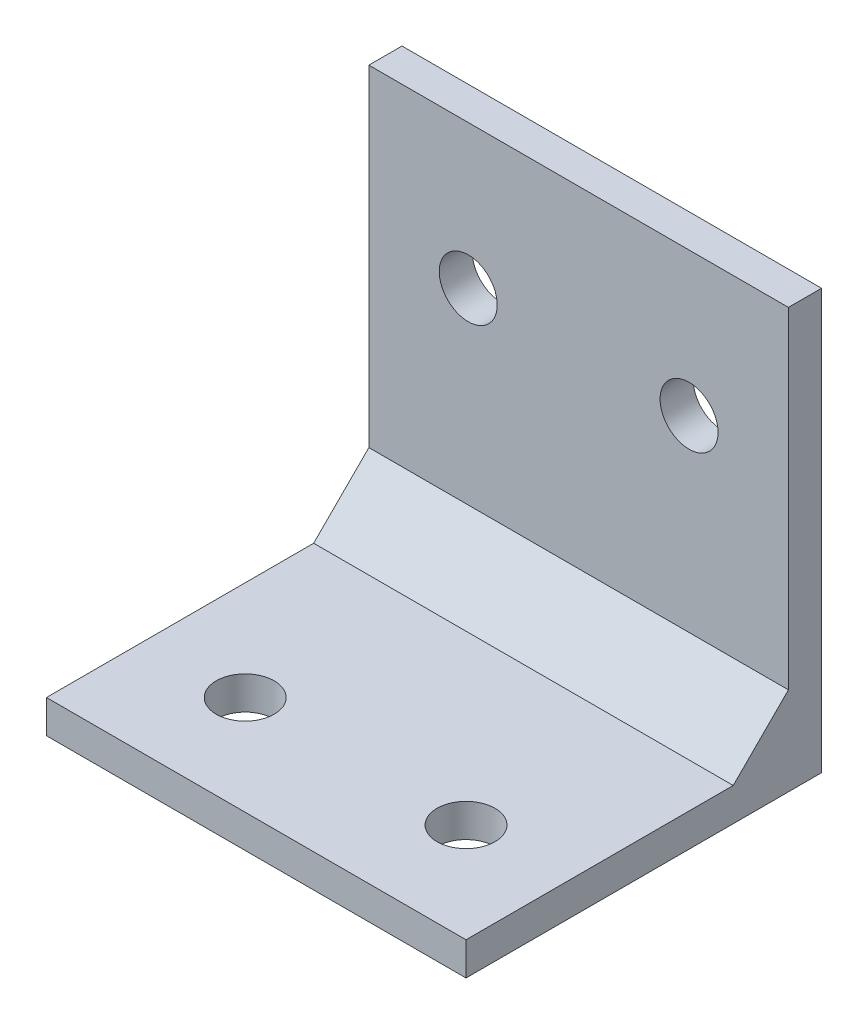
ISO-10303-21;
HEADER;
FILE_DESCRIPTION(('STEP AP214'),'2;1');
FILE_NAME('part.step','',(''),(''),'','','');
FILE_SCHEMA(('AUTOMOTIVE_DESIGN { 1 0 10303 214 1 1 1 1 }'));
ENDSEC;
DATA;
#1=APPLICATION_CONTEXT('core data for automotive mechanical design processes');
#2=APPLICATION_PROTOCOL_DEFINITION('international standard','automotive_design',2000,#1);
#3=PRODUCT_CONTEXT('',#1,'mechanical');
#4=PRODUCT('Part','Part','',(#3));
#5=PRODUCT_RELATED_PRODUCT_CATEGORY('part','',(#4));
#6=PRODUCT_DEFINITION_FORMATION('','',#4);
#7=PRODUCT_DEFINITION_CONTEXT('part definition',#1,'design');
#8=PRODUCT_DEFINITION('design','',#6,#7);
#9=PRODUCT_DEFINITION_SHAPE('','',#8);
#10=(LENGTH_UNIT() NAMED_UNIT(*) SI_UNIT(.MILLI.,.METRE.));
#11=(NAMED_UNIT(*) PLANE_ANGLE_UNIT() SI_UNIT($,.RADIAN.));
#12=(NAMED_UNIT(*) SI_UNIT($,.STERADIAN.) SOLID_ANGLE_UNIT());
#13=UNCERTAINTY_MEASURE_WITH_UNIT(LENGTH_MEASURE(1.E-05),#10,'distance_accuracy_value','');
#14=(GEOMETRIC_REPRESENTATION_CONTEXT(3) GLOBAL_UNCERTAINTY_ASSIGNED_CONTEXT((#13)) GLOBAL_UNIT_ASSIGNED_CONTEXT((#10,
#11,#12)) REPRESENTATION_CONTEXT('',''));
#15=CARTESIAN_POINT('',(0.,0.,0.));
#16=DIRECTION('',(0.,0.,1.));
#17=DIRECTION('',(1.,0.,0.));
#18=AXIS2_PLACEMENT_3D('',#15,#16,#17);
#19=CARTESIAN_POINT('',(0.,3.,0.));
#20=DIRECTION('',(0.,-1.,0.));
#21=DIRECTION('',(0.,0.,-1.));
#22=AXIS2_PLACEMENT_3D('',#19,#20,#21);
#23=PLANE('',#22);
#24=CARTESIAN_POINT('',(-8.99999999999999,3.,23.2));
#25=DIRECTION('',(0.,1.,0.));
#26=DIRECTION('',(0.,0.,-1.));
#27=AXIS2_PLACEMENT_3D('',#24,#25,#26);
#28=CIRCLE('',#27,2.625);
#29=CARTESIAN_POINT('',(-8.99999999999999,3.,20.575));
#30=VERTEX_POINT('',#29);
#31=EDGE_CURVE('E152',#30,#30,#28,.T.);
#32=ORIENTED_EDGE('',*,*,#31,.F.);
#33=EDGE_LOOP('',(#32));
#34=FACE_BOUND('',#33,.T.);
#35=CARTESIAN_POINT('',(-29.,3.,23.2));
#36=DIRECTION('',(0.,1.,0.));
#37=DIRECTION('',(0.,0.,1.));
#38=AXIS2_PLACEMENT_3D('',#35,#36,#37);
#39=CIRCLE('',#38,2.625);
#40=CARTESIAN_POINT('',(-29.,3.,25.825));
#41=VERTEX_POINT('',#40);
#42=EDGE_CURVE('E101',#41,#41,#39,.T.);
#43=ORIENTED_EDGE('',*,*,#42,.F.);
#44=EDGE_LOOP('',(#43));
#45=FACE_BOUND('',#44,.T.);
#46=DIRECTION('',(0.,0.,-1.));
#47=VECTOR('',#46,1.);
#48=CARTESIAN_POINT('',(0.,3.,0.));
#49=LINE('',#48,#47);
#50=CARTESIAN_POINT('',(0.,3.,32.2));
#51=VERTEX_POINT('',#50);
#52=CARTESIAN_POINT('',(0.,3.,8.00000000000001));
#53=VERTEX_POINT('',#52);
#54=EDGE_CURVE('E88',#51,#53,#49,.T.);
#55=ORIENTED_EDGE('',*,*,#54,.T.);
#56=DIRECTION('',(1.,0.,0.));
#57=VECTOR('',#56,1.);
#58=CARTESIAN_POINT('',(-38.,3.,8.00000000000002));
#59=LINE('',#58,#57);
#60=CARTESIAN_POINT('',(-38.,3.,8.00000000000002));
#61=VERTEX_POINT('',#60);
#62=EDGE_CURVE('E169',#61,#53,#59,.T.);
#63=ORIENTED_EDGE('',*,*,#62,.F.);
#64=DIRECTION('',(0.,0.,1.));
#65=VECTOR('',#64,1.);
#66=CARTESIAN_POINT('',(-38.,3.,0.));
#67=LINE('',#66,#65);
#68=CARTESIAN_POINT('',(-38.,3.,32.2));
#69=VERTEX_POINT('',#68);
#70=EDGE_CURVE('E163',#61,#69,#67,.T.);
#71=ORIENTED_EDGE('',*,*,#70,.T.);
#72=DIRECTION('',(1.,0.,0.));
#73=VECTOR('',#72,1.);
#74=CARTESIAN_POINT('',(0.,3.,32.2));
#75=LINE('',#74,#73);
#76=EDGE_CURVE('E57',#69,#51,#75,.T.);
#77=ORIENTED_EDGE('',*,*,#76,.T.);
#78=EDGE_LOOP('',(#55,#63,#71,#77));
#79=FACE_BOUND('',#78,.T.);
#80=ADVANCED_FACE('F39',(#34,#45,#79),#23,.F.);
#81=CARTESIAN_POINT('',(0.,0.,0.));
#82=DIRECTION('',(0.,-1.,0.));
#83=DIRECTION('',(0.,0.,-1.));
#84=AXIS2_PLACEMENT_3D('',#81,#82,#83);
#85=PLANE('',#84);
#86=CARTESIAN_POINT('',(-29.,0.,23.2));
#87=DIRECTION('',(0.,1.,0.));
#88=DIRECTION('',(0.,0.,1.));
#89=AXIS2_PLACEMENT_3D('',#86,#87,#88);
#90=CIRCLE('',#89,2.625);
#91=CARTESIAN_POINT('',(-29.,0.,25.825));
#92=VERTEX_POINT('',#91);
#93=EDGE_CURVE('E107',#92,#92,#90,.T.);
#94=ORIENTED_EDGE('',*,*,#93,.T.);
#95=EDGE_LOOP('',(#94));
#96=FACE_BOUND('',#95,.T.);
#97=DIRECTION('',(0.,0.,-1.));
#98=VECTOR('',#97,1.);
#99=CARTESIAN_POINT('',(0.,0.,0.));
#100=LINE('',#99,#98);
#101=CARTESIAN_POINT('',(0.,0.,32.2));
#102=VERTEX_POINT('',#101);
#103=CARTESIAN_POINT('',(0.,0.,0.));
#104=VERTEX_POINT('',#103);
#105=EDGE_CURVE('E93',#102,#104,#100,.T.);
#106=ORIENTED_EDGE('',*,*,#105,.F.);
#107=DIRECTION('',(1.,0.,0.));
#108=VECTOR('',#107,1.);
#109=CARTESIAN_POINT('',(0.,0.,32.2));
#110=LINE('',#109,#108);
#111=CARTESIAN_POINT('',(-38.,0.,32.2));
#112=VERTEX_POINT('',#111);
#113=EDGE_CURVE('E79',#112,#102,#110,.T.);
#114=ORIENTED_EDGE('',*,*,#113,.F.);
#115=DIRECTION('',(0.,0.,1.));
#116=VECTOR('',#115,1.);
#117=CARTESIAN_POINT('',(-38.,0.,0.));
#118=LINE('',#117,#116);
#119=CARTESIAN_POINT('',(-38.,0.,0.));
#120=VERTEX_POINT('',#119);
#121=EDGE_CURVE('E74',#120,#112,#118,.T.);
#122=ORIENTED_EDGE('',*,*,#121,.F.);
#123=DIRECTION('',(-1.,0.,0.));
#124=VECTOR('',#123,1.);
#125=CARTESIAN_POINT('',(0.,0.,0.));
#126=LINE('',#125,#124);
#127=EDGE_CURVE('E99',#104,#120,#126,.T.);
#128=ORIENTED_EDGE('',*,*,#127,.F.);
#129=EDGE_LOOP('',(#106,#114,#122,#128));
#130=FACE_BOUND('',#129,.T.);
#131=CARTESIAN_POINT('',(-8.99999999999999,0.,23.2));
#132=DIRECTION('',(0.,1.,0.));
#133=DIRECTION('',(0.,0.,-1.));
#134=AXIS2_PLACEMENT_3D('',#131,#132,#133);
#135=CIRCLE('',#134,2.625);
#136=CARTESIAN_POINT('',(-8.99999999999999,0.,20.575));
#137=VERTEX_POINT('',#136);
#138=EDGE_CURVE('E151',#137,#137,#135,.T.);
#139=ORIENTED_EDGE('',*,*,#138,.T.);
#140=EDGE_LOOP('',(#139));
#141=FACE_BOUND('',#140,.T.);
#142=ADVANCED_FACE('F97',(#96,#130,#141),#85,.T.);
#143=CARTESIAN_POINT('',(0.,3.,0.));
#144=DIRECTION('',(-1.,0.,0.));
#145=DIRECTION('',(0.,0.,1.));
#146=AXIS2_PLACEMENT_3D('',#143,#144,#145);
#147=PLANE('',#146);
#148=ORIENTED_EDGE('',*,*,#105,.T.);
#149=DIRECTION('',(0.,-1.,0.));
#150=VECTOR('',#149,1.);
#151=CARTESIAN_POINT('',(0.,3.,0.));
#152=LINE('',#151,#150);
#153=CARTESIAN_POINT('',(0.,38.,0.));
#154=VERTEX_POINT('',#153);
#155=EDGE_CURVE('E11',#154,#104,#152,.T.);
#156=ORIENTED_EDGE('',*,*,#155,.F.);
#157=DIRECTION('',(0.,0.,-1.));
#158=VECTOR('',#157,1.);
#159=CARTESIAN_POINT('',(0.,38.,0.));
#160=LINE('',#159,#158);
#161=CARTESIAN_POINT('',(0.,38.,3.00000000000001));
#162=VERTEX_POINT('',#161);
#163=EDGE_CURVE('E135',#162,#154,#160,.T.);
#164=ORIENTED_EDGE('',*,*,#163,.F.);
#165=DIRECTION('',(0.,-1.,0.));
#166=VECTOR('',#165,1.);
#167=CARTESIAN_POINT('',(0.,38.,3.00000000000001));
#168=LINE('',#167,#166);
#169=CARTESIAN_POINT('',(0.,8.,3.00000000000001));
#170=VERTEX_POINT('',#169);
#171=EDGE_CURVE('E137',#162,#170,#168,.T.);
#172=ORIENTED_EDGE('',*,*,#171,.T.);
#173=DIRECTION('',(0.,-0.707106781186547,0.707106781186548));
#174=VECTOR('',#173,1.);
#175=CARTESIAN_POINT('',(0.,8.,3.00000000000001));
#176=LINE('',#175,#174);
#177=EDGE_CURVE('E189',#170,#53,#176,.T.);
#178=ORIENTED_EDGE('',*,*,#177,.T.);
#179=ORIENTED_EDGE('',*,*,#54,.F.);
#180=DIRECTION('',(0.,-1.,0.));
#181=VECTOR('',#180,1.);
#182=CARTESIAN_POINT('',(0.,3.,32.2));
#183=LINE('',#182,#181);
#184=EDGE_CURVE('E82',#51,#102,#183,.T.);
#185=ORIENTED_EDGE('',*,*,#184,.T.);
#186=EDGE_LOOP('',(#148,#156,#164,#172,#178,#179,#185));
#187=FACE_BOUND('',#186,.T.);
#188=ADVANCED_FACE('F41',(#187),#147,.F.);
#189=CARTESIAN_POINT('',(0.,3.,0.));
#190=DIRECTION('',(0.,0.,1.));
#191=DIRECTION('',(1.,0.,0.));
#192=AXIS2_PLACEMENT_3D('',#189,#190,#191);
#193=PLANE('',#192);
#194=CARTESIAN_POINT('',(-29.,25.,0.));
#195=DIRECTION('',(0.,0.,1.));
#196=DIRECTION('',(1.,0.,0.));
#197=AXIS2_PLACEMENT_3D('',#194,#195,#196);
#198=CIRCLE('',#197,2.625);
#199=CARTESIAN_POINT('',(-26.375,25.,0.));
#200=VERTEX_POINT('',#199);
#201=EDGE_CURVE('E203',#200,#200,#198,.T.);
#202=ORIENTED_EDGE('',*,*,#201,.T.);
#203=EDGE_LOOP('',(#202));
#204=FACE_BOUND('',#203,.T.);
#205=CARTESIAN_POINT('',(-8.99999999999998,25.,0.));
#206=DIRECTION('',(0.,0.,1.));
#207=DIRECTION('',(-1.,0.,0.));
#208=AXIS2_PLACEMENT_3D('',#205,#206,#207);
#209=CIRCLE('',#208,2.625);
#210=CARTESIAN_POINT('',(-6.37499999999998,25.,0.));
#211=VERTEX_POINT('',#210);
#212=EDGE_CURVE('E211',#211,#211,#209,.T.);
#213=ORIENTED_EDGE('',*,*,#212,.T.);
#214=EDGE_LOOP('',(#213));
#215=FACE_BOUND('',#214,.T.);
#216=ORIENTED_EDGE('',*,*,#127,.T.);
#217=DIRECTION('',(0.,-1.,0.));
#218=VECTOR('',#217,1.);
#219=CARTESIAN_POINT('',(-38.,3.,0.));
#220=LINE('',#219,#218);
#221=CARTESIAN_POINT('',(-38.,38.,0.));
#222=VERTEX_POINT('',#221);
#223=EDGE_CURVE('E49',#222,#120,#220,.T.);
#224=ORIENTED_EDGE('',*,*,#223,.F.);
#225=DIRECTION('',(-1.,0.,0.));
#226=VECTOR('',#225,1.);
#227=CARTESIAN_POINT('',(-38.,38.,0.));
#228=LINE('',#227,#226);
#229=EDGE_CURVE('E128',#154,#222,#228,.T.);
#230=ORIENTED_EDGE('',*,*,#229,.F.);
#231=ORIENTED_EDGE('',*,*,#155,.T.);
#232=EDGE_LOOP('',(#216,#224,#230,#231));
#233=FACE_BOUND('',#232,.T.);
#234=ADVANCED_FACE('F126',(#204,#215,#233),#193,.F.);
#235=CARTESIAN_POINT('',(-38.,3.,0.));
#236=DIRECTION('',(1.,0.,0.));
#237=DIRECTION('',(0.,0.,-1.));
#238=AXIS2_PLACEMENT_3D('',#235,#236,#237);
#239=PLANE('',#238);
#240=ORIENTED_EDGE('',*,*,#70,.F.);
#241=DIRECTION('',(0.,-0.707106781186547,0.707106781186548));
#242=VECTOR('',#241,1.);
#243=CARTESIAN_POINT('',(-38.,8.,3.00000000000002));
#244=LINE('',#243,#242);
#245=CARTESIAN_POINT('',(-38.,8.,3.00000000000002));
#246=VERTEX_POINT('',#245);
#247=EDGE_CURVE('E173',#246,#61,#244,.T.);
#248=ORIENTED_EDGE('',*,*,#247,.F.);
#249=DIRECTION('',(0.,-1.,0.));
#250=VECTOR('',#249,1.);
#251=CARTESIAN_POINT('',(-38.,38.,3.));
#252=LINE('',#251,#250);
#253=CARTESIAN_POINT('',(-38.,38.,3.));
#254=VERTEX_POINT('',#253);
#255=EDGE_CURVE('E142',#254,#246,#252,.T.);
#256=ORIENTED_EDGE('',*,*,#255,.F.);
#257=DIRECTION('',(0.,0.,1.));
#258=VECTOR('',#257,1.);
#259=CARTESIAN_POINT('',(-38.,38.,0.));
#260=LINE('',#259,#258);
#261=EDGE_CURVE('E122',#222,#254,#260,.T.);
#262=ORIENTED_EDGE('',*,*,#261,.F.);
#263=ORIENTED_EDGE('',*,*,#223,.T.);
#264=ORIENTED_EDGE('',*,*,#121,.T.);
#265=DIRECTION('',(0.,-1.,0.));
#266=VECTOR('',#265,1.);
#267=CARTESIAN_POINT('',(-38.,3.,32.2));
#268=LINE('',#267,#266);
#269=EDGE_CURVE('E84',#69,#112,#268,.T.);
#270=ORIENTED_EDGE('',*,*,#269,.F.);
#271=EDGE_LOOP('',(#240,#248,#256,#262,#263,#264,#270));
#272=FACE_BOUND('',#271,.T.);
#273=ADVANCED_FACE('F119',(#272),#239,.F.);
#274=CARTESIAN_POINT('',(0.,3.,32.2));
#275=DIRECTION('',(0.,0.,-1.));
#276=DIRECTION('',(-1.,0.,0.));
#277=AXIS2_PLACEMENT_3D('',#274,#275,#276);
#278=PLANE('',#277);
#279=ORIENTED_EDGE('',*,*,#113,.T.);
#280=ORIENTED_EDGE('',*,*,#184,.F.);
#281=ORIENTED_EDGE('',*,*,#76,.F.);
#282=ORIENTED_EDGE('',*,*,#269,.T.);
#283=EDGE_LOOP('',(#279,#280,#281,#282));
#284=FACE_BOUND('',#283,.T.);
#285=ADVANCED_FACE('F81',(#284),#278,.F.);
#286=CARTESIAN_POINT('',(-29.,3.,23.2));
#287=DIRECTION('',(0.,-1.,0.));
#288=DIRECTION('',(0.,0.,-1.));
#289=AXIS2_PLACEMENT_3D('',#286,#287,#288);
#290=CYLINDRICAL_SURFACE('',#289,2.625);
#291=ORIENTED_EDGE('',*,*,#42,.T.);
#292=EDGE_LOOP('',(#291));
#293=FACE_BOUND('',#292,.T.);
#294=ORIENTED_EDGE('',*,*,#93,.F.);
#295=EDGE_LOOP('',(#294));
#296=FACE_BOUND('',#295,.T.);
#297=ADVANCED_FACE('F233',(#293,#296),#290,.F.);
#298=CARTESIAN_POINT('',(-8.99999999999999,3.,23.2));
#299=DIRECTION('',(0.,-1.,0.));
#300=DIRECTION('',(0.,0.,-1.));
#301=AXIS2_PLACEMENT_3D('',#298,#299,#300);
#302=CYLINDRICAL_SURFACE('',#301,2.625);
#303=ORIENTED_EDGE('',*,*,#31,.T.);
#304=EDGE_LOOP('',(#303));
#305=FACE_BOUND('',#304,.T.);
#306=ORIENTED_EDGE('',*,*,#138,.F.);
#307=EDGE_LOOP('',(#306));
#308=FACE_BOUND('',#307,.T.);
#309=ADVANCED_FACE('F225',(#305,#308),#302,.F.);
#310=CARTESIAN_POINT('',(-38.,38.,3.));
#311=DIRECTION('',(0.,0.,-1.));
#312=DIRECTION('',(-1.,0.,0.));
#313=AXIS2_PLACEMENT_3D('',#310,#311,#312);
#314=PLANE('',#313);
#315=CARTESIAN_POINT('',(-29.,25.,3.00000000000001));
#316=DIRECTION('',(0.,0.,1.));
#317=DIRECTION('',(1.,0.,0.));
#318=AXIS2_PLACEMENT_3D('',#315,#316,#317);
#319=CIRCLE('',#318,2.625);
#320=CARTESIAN_POINT('',(-26.375,25.,3.00000000000001));
#321=VERTEX_POINT('',#320);
#322=EDGE_CURVE('E207',#321,#321,#319,.T.);
#323=ORIENTED_EDGE('',*,*,#322,.F.);
#324=EDGE_LOOP('',(#323));
#325=FACE_BOUND('',#324,.T.);
#326=CARTESIAN_POINT('',(-8.99999999999998,25.,3.00000000000001));
#327=DIRECTION('',(0.,0.,1.));
#328=DIRECTION('',(-1.,0.,0.));
#329=AXIS2_PLACEMENT_3D('',#326,#327,#328);
#330=CIRCLE('',#329,2.625);
#331=CARTESIAN_POINT('',(-6.37499999999998,25.,3.00000000000001));
#332=VERTEX_POINT('',#331);
#333=EDGE_CURVE('E198',#332,#332,#330,.T.);
#334=ORIENTED_EDGE('',*,*,#333,.F.);
#335=EDGE_LOOP('',(#334));
#336=FACE_BOUND('',#335,.T.);
#337=ORIENTED_EDGE('',*,*,#255,.T.);
#338=DIRECTION('',(1.,0.,0.));
#339=VECTOR('',#338,1.);
#340=CARTESIAN_POINT('',(-38.,8.,3.00000000000002));
#341=LINE('',#340,#339);
#342=EDGE_CURVE('E193',#246,#170,#341,.T.);
#343=ORIENTED_EDGE('',*,*,#342,.T.);
#344=ORIENTED_EDGE('',*,*,#171,.F.);
#345=DIRECTION('',(1.,0.,0.));
#346=VECTOR('',#345,1.);
#347=CARTESIAN_POINT('',(-38.,38.,3.));
#348=LINE('',#347,#346);
#349=EDGE_CURVE('E144',#254,#162,#348,.T.);
#350=ORIENTED_EDGE('',*,*,#349,.F.);
#351=EDGE_LOOP('',(#337,#343,#344,#350));
#352=FACE_BOUND('',#351,.T.);
#353=ADVANCED_FACE('F192',(#325,#336,#352),#314,.F.);
#354=CARTESIAN_POINT('',(0.,38.,0.));
#355=DIRECTION('',(0.,1.,0.));
#356=DIRECTION('',(0.,0.,1.));
#357=AXIS2_PLACEMENT_3D('',#354,#355,#356);
#358=PLANE('',#357);
#359=ORIENTED_EDGE('',*,*,#261,.T.);
#360=ORIENTED_EDGE('',*,*,#349,.T.);
#361=ORIENTED_EDGE('',*,*,#163,.T.);
#362=ORIENTED_EDGE('',*,*,#229,.T.);
#363=EDGE_LOOP('',(#359,#360,#361,#362));
#364=FACE_BOUND('',#363,.T.);
#365=ADVANCED_FACE('F131',(#364),#358,.T.);
#366=CARTESIAN_POINT('',(-8.99999999999998,25.,0.));
#367=DIRECTION('',(0.,0.,1.));
#368=DIRECTION('',(1.,0.,0.));
#369=AXIS2_PLACEMENT_3D('',#366,#367,#368);
#370=CYLINDRICAL_SURFACE('',#369,2.625);
#371=CARTESIAN_POINT('',(-6.37499999999998,25.,0.));
#372=CARTESIAN_POINT('',(-6.37499999999998,25.,0.03125));
#373=CARTESIAN_POINT('',(-6.37499999999998,25.,0.0625000000000001));
#374=CARTESIAN_POINT('',(-6.37499999999998,25.,0.125));
#375=CARTESIAN_POINT('',(-6.37499999999998,25.,0.15625));
#376=CARTESIAN_POINT('',(-6.37499999999998,25.,0.21875));
#377=CARTESIAN_POINT('',(-6.37499999999998,25.,0.25));
#378=CARTESIAN_POINT('',(-6.37499999999998,25.,0.312500000000001));
#379=CARTESIAN_POINT('',(-6.37499999999998,25.,0.343750000000001));
#380=CARTESIAN_POINT('',(-6.37499999999998,25.,0.406250000000001));
#381=CARTESIAN_POINT('',(-6.37499999999998,25.,0.437500000000001));
#382=CARTESIAN_POINT('',(-6.37499999999998,25.,0.500000000000001));
#383=CARTESIAN_POINT('',(-6.37499999999998,25.,0.531250000000001));
#384=CARTESIAN_POINT('',(-6.37499999999998,25.,0.593750000000001));
#385=CARTESIAN_POINT('',(-6.37499999999998,25.,0.625000000000001));
#386=CARTESIAN_POINT('',(-6.37499999999998,25.,0.687500000000001));
#387=CARTESIAN_POINT('',(-6.37499999999998,25.,0.718750000000001));
#388=CARTESIAN_POINT('',(-6.37499999999998,25.,0.781250000000001));
#389=CARTESIAN_POINT('',(-6.37499999999998,25.,0.812500000000002));
#390=CARTESIAN_POINT('',(-6.37499999999998,25.,0.875000000000002));
#391=CARTESIAN_POINT('',(-6.37499999999998,25.,0.906250000000002));
#392=CARTESIAN_POINT('',(-6.37499999999998,25.,0.968750000000002));
#393=CARTESIAN_POINT('',(-6.37499999999998,25.,1.));
#394=CARTESIAN_POINT('',(-6.37499999999998,25.,1.0625));
#395=CARTESIAN_POINT('',(-6.37499999999998,25.,1.09375));
#396=CARTESIAN_POINT('',(-6.37499999999998,25.,1.15625));
#397=CARTESIAN_POINT('',(-6.37499999999998,25.,1.1875));
#398=CARTESIAN_POINT('',(-6.37499999999998,25.,1.25));
#399=CARTESIAN_POINT('',(-6.37499999999998,25.,1.28125));
#400=CARTESIAN_POINT('',(-6.37499999999998,25.,1.34375));
#401=CARTESIAN_POINT('',(-6.37499999999998,25.,1.375));
#402=CARTESIAN_POINT('',(-6.37499999999998,25.,1.4375));
#403=CARTESIAN_POINT('',(-6.37499999999998,25.,1.46875));
#404=CARTESIAN_POINT('',(-6.37499999999998,25.,1.53125));
#405=CARTESIAN_POINT('',(-6.37499999999998,25.,1.5625));
#406=CARTESIAN_POINT('',(-6.37499999999998,25.,1.625));
#407=CARTESIAN_POINT('',(-6.37499999999998,25.,1.65625));
#408=CARTESIAN_POINT('',(-6.37499999999998,25.,1.71875));
#409=CARTESIAN_POINT('',(-6.37499999999998,25.,1.75));
#410=CARTESIAN_POINT('',(-6.37499999999998,25.,1.8125));
#411=CARTESIAN_POINT('',(-6.37499999999998,25.,1.84375));
#412=CARTESIAN_POINT('',(-6.37499999999998,25.,1.90625));
#413=CARTESIAN_POINT('',(-6.37499999999998,25.,1.9375));
#414=CARTESIAN_POINT('',(-6.37499999999998,25.,2.));
#415=CARTESIAN_POINT('',(-6.37499999999998,25.,2.03125));
#416=CARTESIAN_POINT('',(-6.37499999999998,25.,2.09375));
#417=CARTESIAN_POINT('',(-6.37499999999998,25.,2.125));
#418=CARTESIAN_POINT('',(-6.37499999999998,25.,2.1875));
#419=CARTESIAN_POINT('',(-6.37499999999998,25.,2.21875));
#420=CARTESIAN_POINT('',(-6.37499999999998,25.,2.28125));
#421=CARTESIAN_POINT('',(-6.37499999999998,25.,2.3125));
#422=CARTESIAN_POINT('',(-6.37499999999998,25.,2.375));
#423=CARTESIAN_POINT('',(-6.37499999999998,25.,2.40625));
#424=CARTESIAN_POINT('',(-6.37499999999998,25.,2.46875));
#425=CARTESIAN_POINT('',(-6.37499999999998,25.,2.5));
#426=CARTESIAN_POINT('',(-6.37499999999998,25.,2.5625));
#427=CARTESIAN_POINT('',(-6.37499999999998,25.,2.59375));
#428=CARTESIAN_POINT('',(-6.37499999999998,25.,2.65625));
#429=CARTESIAN_POINT('',(-6.37499999999998,25.,2.6875));
#430=CARTESIAN_POINT('',(-6.37499999999998,25.,2.75));
#431=CARTESIAN_POINT('',(-6.37499999999998,25.,2.78125000000001));
#432=CARTESIAN_POINT('',(-6.37499999999998,25.,2.84375000000001));
#433=CARTESIAN_POINT('',(-6.37499999999998,25.,2.87500000000001));
#434=CARTESIAN_POINT('',(-6.37499999999998,25.,2.93750000000001));
#435=CARTESIAN_POINT('',(-6.37499999999998,25.,2.96875000000001));
#436=CARTESIAN_POINT('',(-6.37499999999998,25.,3.00000000000001));
#437=B_SPLINE_CURVE_WITH_KNOTS('',3,(#371,#372,#373,#374,#375,#376,#377,#378,#379,#380,#381,
#382,#383,#384,#385,#386,#387,#388,#389,#390,#391,#392,#393,#394,#395,#396,#397,#398,#399,#400,
#401,#402,#403,#404,#405,#406,#407,#408,#409,#410,#411,#412,#413,#414,#415,#416,#417,#418,#419,
#420,#421,#422,#423,#424,#425,#426,#427,#428,#429,#430,#431,#432,#433,#434,#435,#436),
.UNSPECIFIED.,.F.,.F.,(4,2,2,2,2,2,2,2,2,2,2,2,2,2,2,2,2,2,2,2,2,2,2,2,2,2,2,2,2,2,2,2,4),(0.,
0.0937500000000002,0.1875,0.28125,0.375000000000001,0.468750000000001,0.562500000000001,
0.656250000000001,0.750000000000001,0.843750000000002,0.937500000000002,1.03125,1.125,1.21875,
1.3125,1.40625,1.5,1.59375,1.6875,1.78125,1.875,1.96875,2.0625,2.15625,2.25,2.34375,2.4375,
2.53125,2.625,2.71875,2.81250000000001,2.90625000000001,3.00000000000001),.UNSPECIFIED.);
#438=EDGE_CURVE('BSEAM222',#211,#332,#437,.T.);
#439=ORIENTED_EDGE('',*,*,#212,.F.);
#440=ORIENTED_EDGE('',*,*,#333,.T.);
#441=ORIENTED_EDGE('',*,*,#438,.T.);
#442=ORIENTED_EDGE('',*,*,#438,.F.);
#443=EDGE_LOOP('',(#439,#441,#440,#442));
#444=FACE_BOUND('',#443,.T.);
#445=ADVANCED_FACE('F222',(#444),#370,.F.);
#446=CARTESIAN_POINT('',(-29.,25.,0.));
#447=DIRECTION('',(0.,0.,1.));
#448=DIRECTION('',(1.,0.,0.));
#449=AXIS2_PLACEMENT_3D('',#446,#447,#448);
#450=CYLINDRICAL_SURFACE('',#449,2.625);
#451=CARTESIAN_POINT('',(-26.375,25.,0.));
#452=CARTESIAN_POINT('',(-26.375,25.,0.03125));
#453=CARTESIAN_POINT('',(-26.375,25.,0.0625000000000001));
#454=CARTESIAN_POINT('',(-26.375,25.,0.125));
#455=CARTESIAN_POINT('',(-26.375,25.,0.15625));
#456=CARTESIAN_POINT('',(-26.375,25.,0.21875));
#457=CARTESIAN_POINT('',(-26.375,25.,0.25));
#458=CARTESIAN_POINT('',(-26.375,25.,0.312500000000001));
#459=CARTESIAN_POINT('',(-26.375,25.,0.343750000000001));
#460=CARTESIAN_POINT('',(-26.375,25.,0.406250000000001));
#461=CARTESIAN_POINT('',(-26.375,25.,0.437500000000001));
#462=CARTESIAN_POINT('',(-26.375,25.,0.500000000000001));
#463=CARTESIAN_POINT('',(-26.375,25.,0.531250000000001));
#464=CARTESIAN_POINT('',(-26.375,25.,0.593750000000001));
#465=CARTESIAN_POINT('',(-26.375,25.,0.625000000000001));
#466=CARTESIAN_POINT('',(-26.375,25.,0.687500000000001));
#467=CARTESIAN_POINT('',(-26.375,25.,0.718750000000001));
#468=CARTESIAN_POINT('',(-26.375,25.,0.781250000000001));
#469=CARTESIAN_POINT('',(-26.375,25.,0.812500000000002));
#470=CARTESIAN_POINT('',(-26.375,25.,0.875000000000002));
#471=CARTESIAN_POINT('',(-26.375,25.,0.906250000000002));
#472=CARTESIAN_POINT('',(-26.375,25.,0.968750000000002));
#473=CARTESIAN_POINT('',(-26.375,25.,1.));
#474=CARTESIAN_POINT('',(-26.375,25.,1.0625));
#475=CARTESIAN_POINT('',(-26.375,25.,1.09375));
#476=CARTESIAN_POINT('',(-26.375,25.,1.15625));
#477=CARTESIAN_POINT('',(-26.375,25.,1.1875));
#478=CARTESIAN_POINT('',(-26.375,25.,1.25));
#479=CARTESIAN_POINT('',(-26.375,25.,1.28125));
#480=CARTESIAN_POINT('',(-26.375,25.,1.34375));
#481=CARTESIAN_POINT('',(-26.375,25.,1.375));
#482=CARTESIAN_POINT('',(-26.375,25.,1.4375));
#483=CARTESIAN_POINT('',(-26.375,25.,1.46875));
#484=CARTESIAN_POINT('',(-26.375,25.,1.53125));
#485=CARTESIAN_POINT('',(-26.375,25.,1.5625));
#486=CARTESIAN_POINT('',(-26.375,25.,1.625));
#487=CARTESIAN_POINT('',(-26.375,25.,1.65625));
#488=CARTESIAN_POINT('',(-26.375,25.,1.71875));
#489=CARTESIAN_POINT('',(-26.375,25.,1.75));
#490=CARTESIAN_POINT('',(-26.375,25.,1.8125));
#491=CARTESIAN_POINT('',(-26.375,25.,1.84375));
#492=CARTESIAN_POINT('',(-26.375,25.,1.90625));
#493=CARTESIAN_POINT('',(-26.375,25.,1.9375));
#494=CARTESIAN_POINT('',(-26.375,25.,2.));
#495=CARTESIAN_POINT('',(-26.375,25.,2.03125));
#496=CARTESIAN_POINT('',(-26.375,25.,2.09375));
#497=CARTESIAN_POINT('',(-26.375,25.,2.125));
#498=CARTESIAN_POINT('',(-26.375,25.,2.1875));
#499=CARTESIAN_POINT('',(-26.375,25.,2.21875));
#500=CARTESIAN_POINT('',(-26.375,25.,2.28125));
#501=CARTESIAN_POINT('',(-26.375,25.,2.3125));
#502=CARTESIAN_POINT('',(-26.375,25.,2.375));
#503=CARTESIAN_POINT('',(-26.375,25.,2.40625));
#504=CARTESIAN_POINT('',(-26.375,25.,2.46875));
#505=CARTESIAN_POINT('',(-26.375,25.,2.5));
#506=CARTESIAN_POINT('',(-26.375,25.,2.5625));
#507=CARTESIAN_POINT('',(-26.375,25.,2.59375));
#508=CARTESIAN_POINT('',(-26.375,25.,2.65625));
#509=CARTESIAN_POINT('',(-26.375,25.,2.6875));
#510=CARTESIAN_POINT('',(-26.375,25.,2.75));
#511=CARTESIAN_POINT('',(-26.375,25.,2.78125000000001));
#512=CARTESIAN_POINT('',(-26.375,25.,2.84375000000001));
#513=CARTESIAN_POINT('',(-26.375,25.,2.87500000000001));
#514=CARTESIAN_POINT('',(-26.375,25.,2.93750000000001));
#515=CARTESIAN_POINT('',(-26.375,25.,2.96875000000001));
#516=CARTESIAN_POINT('',(-26.375,25.,3.00000000000001));
#517=B_SPLINE_CURVE_WITH_KNOTS('',3,(#451,#452,#453,#454,#455,#456,#457,#458,#459,#460,#461,
#462,#463,#464,#465,#466,#467,#468,#469,#470,#471,#472,#473,#474,#475,#476,#477,#478,#479,#480,
#481,#482,#483,#484,#485,#486,#487,#488,#489,#490,#491,#492,#493,#494,#495,#496,#497,#498,#499,
#500,#501,#502,#503,#504,#505,#506,#507,#508,#509,#510,#511,#512,#513,#514,#515,#516),
.UNSPECIFIED.,.F.,.F.,(4,2,2,2,2,2,2,2,2,2,2,2,2,2,2,2,2,2,2,2,2,2,2,2,2,2,2,2,2,2,2,2,4),(0.,
0.0937500000000002,0.1875,0.28125,0.375000000000001,0.468750000000001,0.562500000000001,
0.656250000000001,0.750000000000001,0.843750000000002,0.937500000000002,1.03125,1.125,1.21875,
1.3125,1.40625,1.5,1.59375,1.6875,1.78125,1.875,1.96875,2.0625,2.15625,2.25,2.34375,2.4375,
2.53125,2.625,2.71875,2.81250000000001,2.90625000000001,3.00000000000001),.UNSPECIFIED.);
#518=EDGE_CURVE('BSEAM262',#200,#321,#517,.T.);
#519=ORIENTED_EDGE('',*,*,#201,.F.);
#520=ORIENTED_EDGE('',*,*,#322,.T.);
#521=ORIENTED_EDGE('',*,*,#518,.T.);
#522=ORIENTED_EDGE('',*,*,#518,.F.);
#523=EDGE_LOOP('',(#519,#521,#520,#522));
#524=FACE_BOUND('',#523,.T.);
#525=ADVANCED_FACE('F262',(#524),#450,.F.);
#526=CARTESIAN_POINT('',(-38.,8.,3.00000000000002));
#527=DIRECTION('',(0.,0.707106781186548,0.707106781186548));
#528=DIRECTION('',(0.,-0.707106781186548,0.707106781186548));
#529=AXIS2_PLACEMENT_3D('',#526,#527,#528);
#530=PLANE('',#529);
#531=ORIENTED_EDGE('',*,*,#177,.F.);
#532=ORIENTED_EDGE('',*,*,#342,.F.);
#533=ORIENTED_EDGE('',*,*,#247,.T.);
#534=ORIENTED_EDGE('',*,*,#62,.T.);
#535=EDGE_LOOP('',(#531,#532,#533,#534));
#536=FACE_BOUND('',#535,.T.);
#537=ADVANCED_FACE('F267',(#536),#530,.T.);
#538=CLOSED_SHELL('',(#80,#142,#188,#234,#273,#285,#297,#309,#353,#365,#445,#525,#537));
#539=MANIFOLD_SOLID_BREP('B2',#538);
#540=ADVANCED_BREP_SHAPE_REPRESENTATION('',(#18,#539),#14);
#541=SHAPE_DEFINITION_REPRESENTATION(#9,#540);
ENDSEC;
END-ISO-10303-21;
